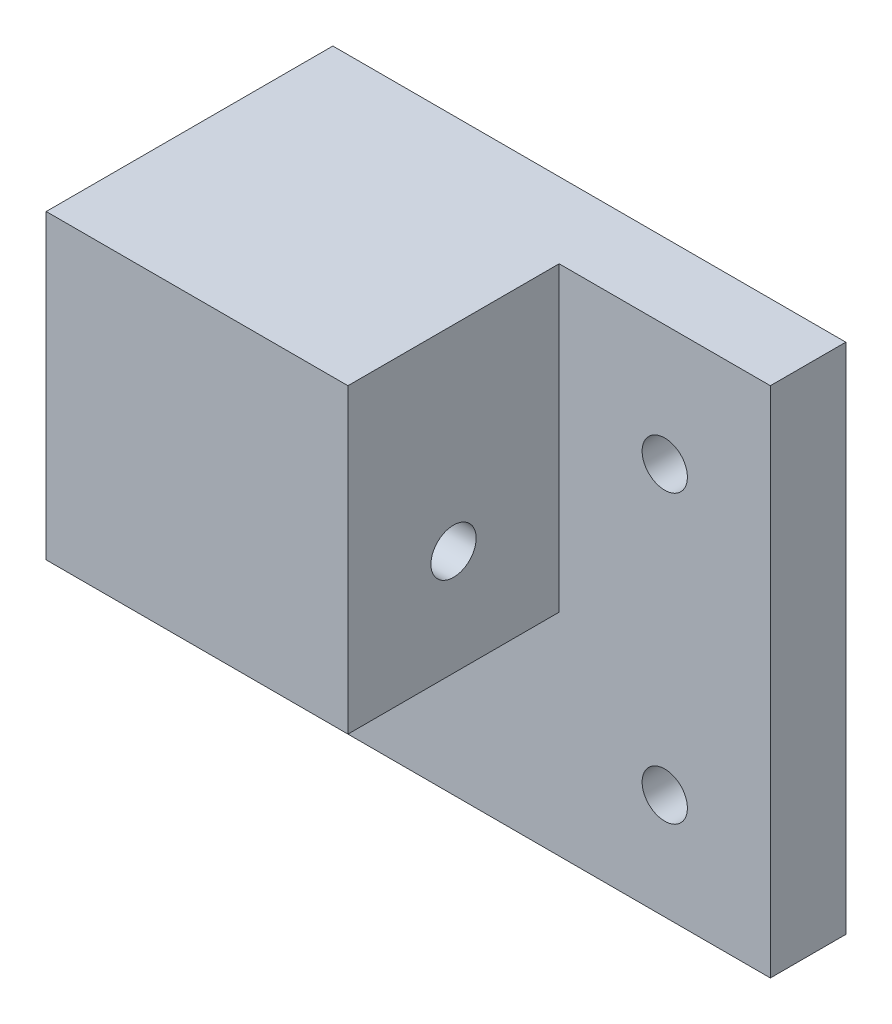
ISO-10303-21;
HEADER;
FILE_DESCRIPTION(('STEP AP214'),'2;1');
FILE_NAME('part.step','',(''),(''),'','','');
FILE_SCHEMA(('AUTOMOTIVE_DESIGN { 1 0 10303 214 1 1 1 1 }'));
ENDSEC;
DATA;
#1=APPLICATION_CONTEXT('core data for automotive mechanical design processes');
#2=APPLICATION_PROTOCOL_DEFINITION('international standard','automotive_design',2000,#1);
#3=PRODUCT_CONTEXT('',#1,'mechanical');
#4=PRODUCT('Part','Part','',(#3));
#5=PRODUCT_RELATED_PRODUCT_CATEGORY('part','',(#4));
#6=PRODUCT_DEFINITION_FORMATION('','',#4);
#7=PRODUCT_DEFINITION_CONTEXT('part definition',#1,'design');
#8=PRODUCT_DEFINITION('design','',#6,#7);
#9=PRODUCT_DEFINITION_SHAPE('','',#8);
#10=(LENGTH_UNIT() NAMED_UNIT(*) SI_UNIT(.MILLI.,.METRE.));
#11=(NAMED_UNIT(*) PLANE_ANGLE_UNIT() SI_UNIT($,.RADIAN.));
#12=(NAMED_UNIT(*) SI_UNIT($,.STERADIAN.) SOLID_ANGLE_UNIT());
#13=UNCERTAINTY_MEASURE_WITH_UNIT(LENGTH_MEASURE(1.E-05),#10,'distance_accuracy_value','');
#14=(GEOMETRIC_REPRESENTATION_CONTEXT(3) GLOBAL_UNCERTAINTY_ASSIGNED_CONTEXT((#13)) GLOBAL_UNIT_ASSIGNED_CONTEXT((#10,
#11,#12)) REPRESENTATION_CONTEXT('',''));
#15=CARTESIAN_POINT('',(0.,0.,0.));
#16=DIRECTION('',(0.,0.,1.));
#17=DIRECTION('',(1.,0.,0.));
#18=AXIS2_PLACEMENT_3D('',#15,#16,#17);
#19=CARTESIAN_POINT('',(-42.,-20.,24.));
#20=DIRECTION('',(0.,-1.,0.));
#21=DIRECTION('',(0.,0.,-1.));
#22=AXIS2_PLACEMENT_3D('',#19,#20,#21);
#23=CYLINDRICAL_SURFACE('',#22,3.);
#24=CARTESIAN_POINT('',(-42.,-40.,24.));
#25=DIRECTION('',(0.,-1.,0.));
#26=DIRECTION('',(0.,0.,-1.));
#27=AXIS2_PLACEMENT_3D('',#24,#25,#26);
#28=CIRCLE('',#27,3.);
#29=CARTESIAN_POINT('',(-42.,-40.,21.));
#30=VERTEX_POINT('',#29);
#31=EDGE_CURVE('E165',#30,#30,#28,.T.);
#32=ORIENTED_EDGE('',*,*,#31,.T.);
#33=EDGE_LOOP('',(#32));
#34=FACE_BOUND('',#33,.T.);
#35=CARTESIAN_POINT('',(-42.,-26.,24.));
#36=DIRECTION('',(-0.707106781186547,-0.707106781186548,0.));
#37=DIRECTION('',(0.707106781186548,-0.707106781186547,0.));
#38=AXIS2_PLACEMENT_3D('',#35,#36,#37);
#39=ELLIPSE('',#38,4.24264068711929,3.);
#40=CARTESIAN_POINT('',(-42.,-26.,27.));
#41=VERTEX_POINT('',#40);
#42=CARTESIAN_POINT('',(-42.,-26.,21.));
#43=VERTEX_POINT('',#42);
#44=EDGE_CURVE('E48',#41,#43,#39,.F.);
#45=ORIENTED_EDGE('',*,*,#44,.T.);
#46=CARTESIAN_POINT('',(-42.,-26.,24.));
#47=DIRECTION('',(0.707106781186548,-0.707106781186547,0.));
#48=DIRECTION('',(-0.707106781186547,-0.707106781186548,0.));
#49=AXIS2_PLACEMENT_3D('',#46,#47,#48);
#50=ELLIPSE('',#49,4.24264068711929,3.);
#51=EDGE_CURVE('E11',#43,#41,#50,.F.);
#52=ORIENTED_EDGE('',*,*,#51,.T.);
#53=EDGE_LOOP('',(#45,#52));
#54=FACE_BOUND('',#53,.T.);
#55=ADVANCED_FACE('F35',(#34,#54),#23,.F.);
#56=CARTESIAN_POINT('',(0.,0.,10.));
#57=DIRECTION('',(0.,0.,-1.));
#58=DIRECTION('',(-1.,0.,0.));
#59=AXIS2_PLACEMENT_3D('',#56,#57,#58);
#60=PLANE('',#59);
#61=CARTESIAN_POINT('',(-52.,-54.,10.));
#62=DIRECTION('',(0.,0.,1.));
#63=DIRECTION('',(1.,0.,0.));
#64=AXIS2_PLACEMENT_3D('',#61,#62,#63);
#65=CIRCLE('',#64,3.);
#66=CARTESIAN_POINT('',(-49.,-54.,10.));
#67=VERTEX_POINT('',#66);
#68=EDGE_CURVE('E183',#67,#67,#65,.T.);
#69=ORIENTED_EDGE('',*,*,#68,.F.);
#70=EDGE_LOOP('',(#69));
#71=FACE_BOUND('',#70,.T.);
#72=CARTESIAN_POINT('',(-14.,-16.,10.));
#73=DIRECTION('',(0.,0.,1.));
#74=DIRECTION('',(1.,0.,0.));
#75=AXIS2_PLACEMENT_3D('',#72,#73,#74);
#76=CIRCLE('',#75,3.);
#77=CARTESIAN_POINT('',(-11.,-16.,10.));
#78=VERTEX_POINT('',#77);
#79=EDGE_CURVE('E189',#78,#78,#76,.T.);
#80=ORIENTED_EDGE('',*,*,#79,.F.);
#81=EDGE_LOOP('',(#80));
#82=FACE_BOUND('',#81,.T.);
#83=CARTESIAN_POINT('',(-14.,-54.,10.));
#84=DIRECTION('',(0.,0.,1.));
#85=DIRECTION('',(1.,0.,0.));
#86=AXIS2_PLACEMENT_3D('',#83,#84,#85);
#87=CIRCLE('',#86,3.);
#88=CARTESIAN_POINT('',(-11.,-54.,10.));
#89=VERTEX_POINT('',#88);
#90=EDGE_CURVE('E177',#89,#89,#87,.T.);
#91=ORIENTED_EDGE('',*,*,#90,.F.);
#92=EDGE_LOOP('',(#91));
#93=FACE_BOUND('',#92,.T.);
#94=DIRECTION('',(0.,1.,0.));
#95=VECTOR('',#94,1.);
#96=CARTESIAN_POINT('',(-28.,0.,10.));
#97=LINE('',#96,#95);
#98=CARTESIAN_POINT('',(-28.,-40.,10.));
#99=VERTEX_POINT('',#98);
#100=CARTESIAN_POINT('',(-28.,0.,10.));
#101=VERTEX_POINT('',#100);
#102=EDGE_CURVE('E151',#99,#101,#97,.T.);
#103=ORIENTED_EDGE('',*,*,#102,.F.);
#104=DIRECTION('',(1.,0.,0.));
#105=VECTOR('',#104,1.);
#106=CARTESIAN_POINT('',(-68.,-40.,10.));
#107=LINE('',#106,#105);
#108=CARTESIAN_POINT('',(-68.,-40.,10.));
#109=VERTEX_POINT('',#108);
#110=EDGE_CURVE('E56',#109,#99,#107,.T.);
#111=ORIENTED_EDGE('',*,*,#110,.F.);
#112=DIRECTION('',(0.,-1.,0.));
#113=VECTOR('',#112,1.);
#114=CARTESIAN_POINT('',(-68.,0.,10.));
#115=LINE('',#114,#113);
#116=CARTESIAN_POINT('',(-68.,-68.,10.));
#117=VERTEX_POINT('',#116);
#118=EDGE_CURVE('E136',#109,#117,#115,.T.);
#119=ORIENTED_EDGE('',*,*,#118,.T.);
#120=DIRECTION('',(1.,0.,0.));
#121=VECTOR('',#120,1.);
#122=CARTESIAN_POINT('',(0.,-68.,10.));
#123=LINE('',#122,#121);
#124=CARTESIAN_POINT('',(0.,-68.,10.));
#125=VERTEX_POINT('',#124);
#126=EDGE_CURVE('E123',#117,#125,#123,.T.);
#127=ORIENTED_EDGE('',*,*,#126,.T.);
#128=DIRECTION('',(0.,1.,0.));
#129=VECTOR('',#128,1.);
#130=CARTESIAN_POINT('',(0.,0.,10.));
#131=LINE('',#130,#129);
#132=CARTESIAN_POINT('',(0.,0.,10.));
#133=VERTEX_POINT('',#132);
#134=EDGE_CURVE('E126',#125,#133,#131,.T.);
#135=ORIENTED_EDGE('',*,*,#134,.T.);
#136=DIRECTION('',(-1.,0.,0.));
#137=VECTOR('',#136,1.);
#138=CARTESIAN_POINT('',(0.,0.,10.));
#139=LINE('',#138,#137);
#140=EDGE_CURVE('E138',#133,#101,#139,.T.);
#141=ORIENTED_EDGE('',*,*,#140,.T.);
#142=EDGE_LOOP('',(#103,#111,#119,#127,#135,#141));
#143=FACE_BOUND('',#142,.T.);
#144=ADVANCED_FACE('F206',(#71,#82,#93,#143),#60,.F.);
#145=CARTESIAN_POINT('',(0.,0.,10.));
#146=DIRECTION('',(-1.,0.,0.));
#147=DIRECTION('',(0.,-1.,0.));
#148=AXIS2_PLACEMENT_3D('',#145,#146,#147);
#149=PLANE('',#148);
#150=DIRECTION('',(0.,1.,0.));
#151=VECTOR('',#150,1.);
#152=CARTESIAN_POINT('',(0.,0.,0.));
#153=LINE('',#152,#151);
#154=CARTESIAN_POINT('',(0.,-68.,0.));
#155=VERTEX_POINT('',#154);
#156=CARTESIAN_POINT('',(0.,0.,0.));
#157=VERTEX_POINT('',#156);
#158=EDGE_CURVE('E131',#155,#157,#153,.T.);
#159=ORIENTED_EDGE('',*,*,#158,.T.);
#160=DIRECTION('',(0.,0.,-1.));
#161=VECTOR('',#160,1.);
#162=CARTESIAN_POINT('',(0.,0.,10.));
#163=LINE('',#162,#161);
#164=EDGE_CURVE('E107',#133,#157,#163,.T.);
#165=ORIENTED_EDGE('',*,*,#164,.F.);
#166=ORIENTED_EDGE('',*,*,#134,.F.);
#167=DIRECTION('',(0.,0.,-1.));
#168=VECTOR('',#167,1.);
#169=CARTESIAN_POINT('',(0.,-68.,10.));
#170=LINE('',#169,#168);
#171=EDGE_CURVE('E120',#125,#155,#170,.T.);
#172=ORIENTED_EDGE('',*,*,#171,.T.);
#173=EDGE_LOOP('',(#159,#165,#166,#172));
#174=FACE_BOUND('',#173,.T.);
#175=ADVANCED_FACE('F37',(#174),#149,.F.);
#176=CARTESIAN_POINT('',(0.,0.,10.));
#177=DIRECTION('',(0.,-1.,0.));
#178=DIRECTION('',(1.,0.,0.));
#179=AXIS2_PLACEMENT_3D('',#176,#177,#178);
#180=PLANE('',#179);
#181=DIRECTION('',(-1.,0.,0.));
#182=VECTOR('',#181,1.);
#183=CARTESIAN_POINT('',(0.,0.,0.));
#184=LINE('',#183,#182);
#185=CARTESIAN_POINT('',(-68.,0.,0.));
#186=VERTEX_POINT('',#185);
#187=EDGE_CURVE('E129',#157,#186,#184,.T.);
#188=ORIENTED_EDGE('',*,*,#187,.T.);
#189=DIRECTION('',(0.,0.,-1.));
#190=VECTOR('',#189,1.);
#191=CARTESIAN_POINT('',(-68.,0.,10.));
#192=LINE('',#191,#190);
#193=CARTESIAN_POINT('',(-68.,0.,38.));
#194=VERTEX_POINT('',#193);
#195=EDGE_CURVE('E114',#194,#186,#192,.T.);
#196=ORIENTED_EDGE('',*,*,#195,.F.);
#197=DIRECTION('',(-1.,0.,0.));
#198=VECTOR('',#197,1.);
#199=CARTESIAN_POINT('',(-68.,0.,38.));
#200=LINE('',#199,#198);
#201=CARTESIAN_POINT('',(-28.,0.,38.));
#202=VERTEX_POINT('',#201);
#203=EDGE_CURVE('E150',#202,#194,#200,.T.);
#204=ORIENTED_EDGE('',*,*,#203,.F.);
#205=DIRECTION('',(0.,0.,-1.));
#206=VECTOR('',#205,1.);
#207=CARTESIAN_POINT('',(-28.,0.,38.));
#208=LINE('',#207,#206);
#209=EDGE_CURVE('E147',#202,#101,#208,.T.);
#210=ORIENTED_EDGE('',*,*,#209,.T.);
#211=ORIENTED_EDGE('',*,*,#140,.F.);
#212=ORIENTED_EDGE('',*,*,#164,.T.);
#213=EDGE_LOOP('',(#188,#196,#204,#210,#211,#212));
#214=FACE_BOUND('',#213,.T.);
#215=ADVANCED_FACE('F237',(#214),#180,.F.);
#216=CARTESIAN_POINT('',(-68.,0.,10.));
#217=DIRECTION('',(1.,0.,0.));
#218=DIRECTION('',(0.,1.,0.));
#219=AXIS2_PLACEMENT_3D('',#216,#217,#218);
#220=PLANE('',#219);
#221=DIRECTION('',(0.,-1.,0.));
#222=VECTOR('',#221,1.);
#223=CARTESIAN_POINT('',(-68.,0.,0.));
#224=LINE('',#223,#222);
#225=CARTESIAN_POINT('',(-68.,-68.,0.));
#226=VERTEX_POINT('',#225);
#227=EDGE_CURVE('E127',#186,#226,#224,.T.);
#228=ORIENTED_EDGE('',*,*,#227,.T.);
#229=DIRECTION('',(0.,0.,-1.));
#230=VECTOR('',#229,1.);
#231=CARTESIAN_POINT('',(-68.,-68.,10.));
#232=LINE('',#231,#230);
#233=EDGE_CURVE('E117',#117,#226,#232,.T.);
#234=ORIENTED_EDGE('',*,*,#233,.F.);
#235=ORIENTED_EDGE('',*,*,#118,.F.);
#236=DIRECTION('',(0.,0.,-1.));
#237=VECTOR('',#236,1.);
#238=CARTESIAN_POINT('',(-68.,-40.,38.));
#239=LINE('',#238,#237);
#240=CARTESIAN_POINT('',(-68.,-40.,38.));
#241=VERTEX_POINT('',#240);
#242=EDGE_CURVE('E134',#241,#109,#239,.T.);
#243=ORIENTED_EDGE('',*,*,#242,.F.);
#244=DIRECTION('',(0.,-1.,0.));
#245=VECTOR('',#244,1.);
#246=CARTESIAN_POINT('',(-68.,0.,38.));
#247=LINE('',#246,#245);
#248=EDGE_CURVE('E154',#194,#241,#247,.T.);
#249=ORIENTED_EDGE('',*,*,#248,.F.);
#250=ORIENTED_EDGE('',*,*,#195,.T.);
#251=EDGE_LOOP('',(#228,#234,#235,#243,#249,#250));
#252=FACE_BOUND('',#251,.T.);
#253=ADVANCED_FACE('F225',(#252),#220,.F.);
#254=CARTESIAN_POINT('',(0.,-68.,10.));
#255=DIRECTION('',(0.,1.,0.));
#256=DIRECTION('',(-1.,0.,0.));
#257=AXIS2_PLACEMENT_3D('',#254,#255,#256);
#258=PLANE('',#257);
#259=DIRECTION('',(1.,0.,0.));
#260=VECTOR('',#259,1.);
#261=CARTESIAN_POINT('',(0.,-68.,0.));
#262=LINE('',#261,#260);
#263=EDGE_CURVE('E124',#226,#155,#262,.T.);
#264=ORIENTED_EDGE('',*,*,#263,.T.);
#265=ORIENTED_EDGE('',*,*,#171,.F.);
#266=ORIENTED_EDGE('',*,*,#126,.F.);
#267=ORIENTED_EDGE('',*,*,#233,.T.);
#268=EDGE_LOOP('',(#264,#265,#266,#267));
#269=FACE_BOUND('',#268,.T.);
#270=ADVANCED_FACE('F232',(#269),#258,.F.);
#271=CARTESIAN_POINT('',(0.,0.,0.));
#272=DIRECTION('',(0.,0.,-1.));
#273=DIRECTION('',(-1.,0.,0.));
#274=AXIS2_PLACEMENT_3D('',#271,#272,#273);
#275=PLANE('',#274);
#276=CARTESIAN_POINT('',(-52.,-54.,0.));
#277=DIRECTION('',(0.,0.,1.));
#278=DIRECTION('',(1.,0.,0.));
#279=AXIS2_PLACEMENT_3D('',#276,#277,#278);
#280=CIRCLE('',#279,3.);
#281=CARTESIAN_POINT('',(-49.,-54.,0.));
#282=VERTEX_POINT('',#281);
#283=EDGE_CURVE('E186',#282,#282,#280,.T.);
#284=ORIENTED_EDGE('',*,*,#283,.T.);
#285=EDGE_LOOP('',(#284));
#286=FACE_BOUND('',#285,.T.);
#287=CARTESIAN_POINT('',(-14.,-16.,0.));
#288=DIRECTION('',(0.,0.,1.));
#289=DIRECTION('',(1.,0.,0.));
#290=AXIS2_PLACEMENT_3D('',#287,#288,#289);
#291=CIRCLE('',#290,3.);
#292=CARTESIAN_POINT('',(-11.,-16.,0.));
#293=VERTEX_POINT('',#292);
#294=EDGE_CURVE('E180',#293,#293,#291,.T.);
#295=ORIENTED_EDGE('',*,*,#294,.T.);
#296=EDGE_LOOP('',(#295));
#297=FACE_BOUND('',#296,.T.);
#298=CARTESIAN_POINT('',(-14.,-54.,0.));
#299=DIRECTION('',(0.,0.,1.));
#300=DIRECTION('',(1.,0.,0.));
#301=AXIS2_PLACEMENT_3D('',#298,#299,#300);
#302=CIRCLE('',#301,3.);
#303=CARTESIAN_POINT('',(-11.,-54.,0.));
#304=VERTEX_POINT('',#303);
#305=EDGE_CURVE('E174',#304,#304,#302,.T.);
#306=ORIENTED_EDGE('',*,*,#305,.T.);
#307=EDGE_LOOP('',(#306));
#308=FACE_BOUND('',#307,.T.);
#309=ORIENTED_EDGE('',*,*,#158,.F.);
#310=ORIENTED_EDGE('',*,*,#263,.F.);
#311=ORIENTED_EDGE('',*,*,#227,.F.);
#312=ORIENTED_EDGE('',*,*,#187,.F.);
#313=EDGE_LOOP('',(#309,#310,#311,#312));
#314=FACE_BOUND('',#313,.T.);
#315=ADVANCED_FACE('F195',(#286,#297,#308,#314),#275,.T.);
#316=CARTESIAN_POINT('',(-68.,-40.,38.));
#317=DIRECTION('',(0.,1.,0.));
#318=DIRECTION('',(0.,0.,1.));
#319=AXIS2_PLACEMENT_3D('',#316,#317,#318);
#320=PLANE('',#319);
#321=ORIENTED_EDGE('',*,*,#31,.F.);
#322=EDGE_LOOP('',(#321));
#323=FACE_BOUND('',#322,.T.);
#324=ORIENTED_EDGE('',*,*,#110,.T.);
#325=DIRECTION('',(0.,0.,-1.));
#326=VECTOR('',#325,1.);
#327=CARTESIAN_POINT('',(-28.,-40.,38.));
#328=LINE('',#327,#326);
#329=CARTESIAN_POINT('',(-28.,-40.,38.));
#330=VERTEX_POINT('',#329);
#331=EDGE_CURVE('E144',#330,#99,#328,.T.);
#332=ORIENTED_EDGE('',*,*,#331,.F.);
#333=DIRECTION('',(1.,0.,0.));
#334=VECTOR('',#333,1.);
#335=CARTESIAN_POINT('',(-68.,-40.,38.));
#336=LINE('',#335,#334);
#337=EDGE_CURVE('E161',#241,#330,#336,.T.);
#338=ORIENTED_EDGE('',*,*,#337,.F.);
#339=ORIENTED_EDGE('',*,*,#242,.T.);
#340=EDGE_LOOP('',(#324,#332,#338,#339));
#341=FACE_BOUND('',#340,.T.);
#342=ADVANCED_FACE('F216',(#323,#341),#320,.F.);
#343=CARTESIAN_POINT('',(-28.,0.,38.));
#344=DIRECTION('',(-1.,0.,0.));
#345=DIRECTION('',(0.,-1.,0.));
#346=AXIS2_PLACEMENT_3D('',#343,#344,#345);
#347=PLANE('',#346);
#348=CARTESIAN_POINT('',(-28.,-26.,24.));
#349=DIRECTION('',(1.,0.,0.));
#350=DIRECTION('',(0.,1.,0.));
#351=AXIS2_PLACEMENT_3D('',#348,#349,#350);
#352=CIRCLE('',#351,3.);
#353=CARTESIAN_POINT('',(-28.,-23.,24.));
#354=VERTEX_POINT('',#353);
#355=EDGE_CURVE('E171',#354,#354,#352,.T.);
#356=ORIENTED_EDGE('',*,*,#355,.F.);
#357=EDGE_LOOP('',(#356));
#358=FACE_BOUND('',#357,.T.);
#359=ORIENTED_EDGE('',*,*,#102,.T.);
#360=ORIENTED_EDGE('',*,*,#209,.F.);
#361=DIRECTION('',(0.,1.,0.));
#362=VECTOR('',#361,1.);
#363=CARTESIAN_POINT('',(-28.,0.,38.));
#364=LINE('',#363,#362);
#365=EDGE_CURVE('E159',#330,#202,#364,.T.);
#366=ORIENTED_EDGE('',*,*,#365,.F.);
#367=ORIENTED_EDGE('',*,*,#331,.T.);
#368=EDGE_LOOP('',(#359,#360,#366,#367));
#369=FACE_BOUND('',#368,.T.);
#370=ADVANCED_FACE('F219',(#358,#369),#347,.F.);
#371=CARTESIAN_POINT('',(0.,0.,38.));
#372=DIRECTION('',(0.,0.,1.));
#373=DIRECTION('',(1.,0.,0.));
#374=AXIS2_PLACEMENT_3D('',#371,#372,#373);
#375=PLANE('',#374);
#376=ORIENTED_EDGE('',*,*,#248,.T.);
#377=ORIENTED_EDGE('',*,*,#337,.T.);
#378=ORIENTED_EDGE('',*,*,#365,.T.);
#379=ORIENTED_EDGE('',*,*,#203,.T.);
#380=EDGE_LOOP('',(#376,#377,#378,#379));
#381=FACE_BOUND('',#380,.T.);
#382=ADVANCED_FACE('F222',(#381),#375,.T.);
#383=CARTESIAN_POINT('',(-48.,-26.,24.));
#384=DIRECTION('',(1.,0.,0.));
#385=DIRECTION('',(0.,1.,0.));
#386=AXIS2_PLACEMENT_3D('',#383,#384,#385);
#387=CYLINDRICAL_SURFACE('',#386,3.);
#388=ORIENTED_EDGE('',*,*,#355,.T.);
#389=EDGE_LOOP('',(#388));
#390=FACE_BOUND('',#389,.T.);
#391=ORIENTED_EDGE('',*,*,#44,.F.);
#392=CARTESIAN_POINT('',(-42.,-26.,24.));
#393=DIRECTION('',(0.707106781186548,-0.707106781186547,0.));
#394=DIRECTION('',(-0.707106781186547,-0.707106781186548,0.));
#395=AXIS2_PLACEMENT_3D('',#392,#393,#394);
#396=ELLIPSE('',#395,4.24264068711929,3.);
#397=EDGE_CURVE('E43',#43,#41,#396,.T.);
#398=ORIENTED_EDGE('',*,*,#397,.F.);
#399=EDGE_LOOP('',(#391,#398));
#400=FACE_BOUND('',#399,.T.);
#401=ADVANCED_FACE('F106',(#390,#400),#387,.F.);
#402=CARTESIAN_POINT('',(-42.,-20.,24.));
#403=DIRECTION('',(0.,-1.,0.));
#404=DIRECTION('',(0.,0.,-1.));
#405=AXIS2_PLACEMENT_3D('',#402,#403,#404);
#406=PLANE('',#405);
#407=CARTESIAN_POINT('',(-42.,-20.,24.));
#408=DIRECTION('',(0.,-1.,0.));
#409=DIRECTION('',(0.,0.,-1.));
#410=AXIS2_PLACEMENT_3D('',#407,#408,#409);
#411=CIRCLE('',#410,3.);
#412=CARTESIAN_POINT('',(-42.,-20.,21.));
#413=VERTEX_POINT('',#412);
#414=EDGE_CURVE('E156',#413,#413,#411,.T.);
#415=ORIENTED_EDGE('',*,*,#414,.T.);
#416=EDGE_LOOP('',(#415));
#417=FACE_BOUND('',#416,.T.);
#418=ADVANCED_FACE('F258',(#417),#406,.T.);
#419=CARTESIAN_POINT('',(-42.,-26.,24.));
#420=DIRECTION('',(-0.707106781186547,-0.707106781186548,0.));
#421=DIRECTION('',(0.707106781186548,-0.707106781186547,0.));
#422=AXIS2_PLACEMENT_3D('',#419,#420,#421);
#423=ELLIPSE('',#422,4.24264068711929,3.);
#424=EDGE_CURVE('E100',#41,#43,#423,.T.);
#425=ORIENTED_EDGE('',*,*,#424,.T.);
#426=ORIENTED_EDGE('',*,*,#397,.T.);
#427=EDGE_LOOP('',(#425,#426));
#428=FACE_BOUND('',#427,.T.);
#429=ORIENTED_EDGE('',*,*,#414,.F.);
#430=EDGE_LOOP('',(#429));
#431=FACE_BOUND('',#430,.T.);
#432=ADVANCED_FACE('F109',(#428,#431),#23,.F.);
#433=CARTESIAN_POINT('',(-48.,-26.,24.));
#434=DIRECTION('',(1.,0.,0.));
#435=DIRECTION('',(0.,1.,0.));
#436=AXIS2_PLACEMENT_3D('',#433,#434,#435);
#437=CIRCLE('',#436,3.);
#438=CARTESIAN_POINT('',(-48.,-23.,24.));
#439=VERTEX_POINT('',#438);
#440=EDGE_CURVE('E168',#439,#439,#437,.T.);
#441=ORIENTED_EDGE('',*,*,#440,.F.);
#442=EDGE_LOOP('',(#441));
#443=FACE_BOUND('',#442,.T.);
#444=ORIENTED_EDGE('',*,*,#424,.F.);
#445=ORIENTED_EDGE('',*,*,#51,.F.);
#446=EDGE_LOOP('',(#444,#445));
#447=FACE_BOUND('',#446,.T.);
#448=ADVANCED_FACE('F101',(#443,#447),#387,.F.);
#449=CARTESIAN_POINT('',(-48.,-26.,24.));
#450=DIRECTION('',(1.,0.,0.));
#451=DIRECTION('',(0.,1.,0.));
#452=AXIS2_PLACEMENT_3D('',#449,#450,#451);
#453=PLANE('',#452);
#454=ORIENTED_EDGE('',*,*,#440,.T.);
#455=EDGE_LOOP('',(#454));
#456=FACE_BOUND('',#455,.T.);
#457=ADVANCED_FACE('F263',(#456),#453,.T.);
#458=CARTESIAN_POINT('',(-14.,-54.,0.));
#459=DIRECTION('',(0.,0.,1.));
#460=DIRECTION('',(1.,0.,0.));
#461=AXIS2_PLACEMENT_3D('',#458,#459,#460);
#462=CYLINDRICAL_SURFACE('',#461,3.);
#463=ORIENTED_EDGE('',*,*,#305,.F.);
#464=EDGE_LOOP('',(#463));
#465=FACE_BOUND('',#464,.T.);
#466=ORIENTED_EDGE('',*,*,#90,.T.);
#467=EDGE_LOOP('',(#466));
#468=FACE_BOUND('',#467,.T.);
#469=ADVANCED_FACE('F202',(#465,#468),#462,.F.);
#470=CARTESIAN_POINT('',(-14.,-16.,0.));
#471=DIRECTION('',(0.,0.,1.));
#472=DIRECTION('',(1.,0.,0.));
#473=AXIS2_PLACEMENT_3D('',#470,#471,#472);
#474=CYLINDRICAL_SURFACE('',#473,3.);
#475=ORIENTED_EDGE('',*,*,#294,.F.);
#476=EDGE_LOOP('',(#475));
#477=FACE_BOUND('',#476,.T.);
#478=ORIENTED_EDGE('',*,*,#79,.T.);
#479=EDGE_LOOP('',(#478));
#480=FACE_BOUND('',#479,.T.);
#481=ADVANCED_FACE('F198',(#477,#480),#474,.F.);
#482=CARTESIAN_POINT('',(-52.,-54.,0.));
#483=DIRECTION('',(0.,0.,1.));
#484=DIRECTION('',(1.,0.,0.));
#485=AXIS2_PLACEMENT_3D('',#482,#483,#484);
#486=CYLINDRICAL_SURFACE('',#485,3.);
#487=ORIENTED_EDGE('',*,*,#283,.F.);
#488=EDGE_LOOP('',(#487));
#489=FACE_BOUND('',#488,.T.);
#490=ORIENTED_EDGE('',*,*,#68,.T.);
#491=EDGE_LOOP('',(#490));
#492=FACE_BOUND('',#491,.T.);
#493=ADVANCED_FACE('F201',(#489,#492),#486,.F.);
#494=CLOSED_SHELL('',(#55,#144,#175,#215,#253,#270,#315,#342,#370,#382,#401,#418,#432,#448,#457,
#469,#481,#493));
#495=MANIFOLD_SOLID_BREP('B2',#494);
#496=ADVANCED_BREP_SHAPE_REPRESENTATION('',(#18,#495),#14);
#497=SHAPE_DEFINITION_REPRESENTATION(#9,#496);
ENDSEC;
END-ISO-10303-21;
